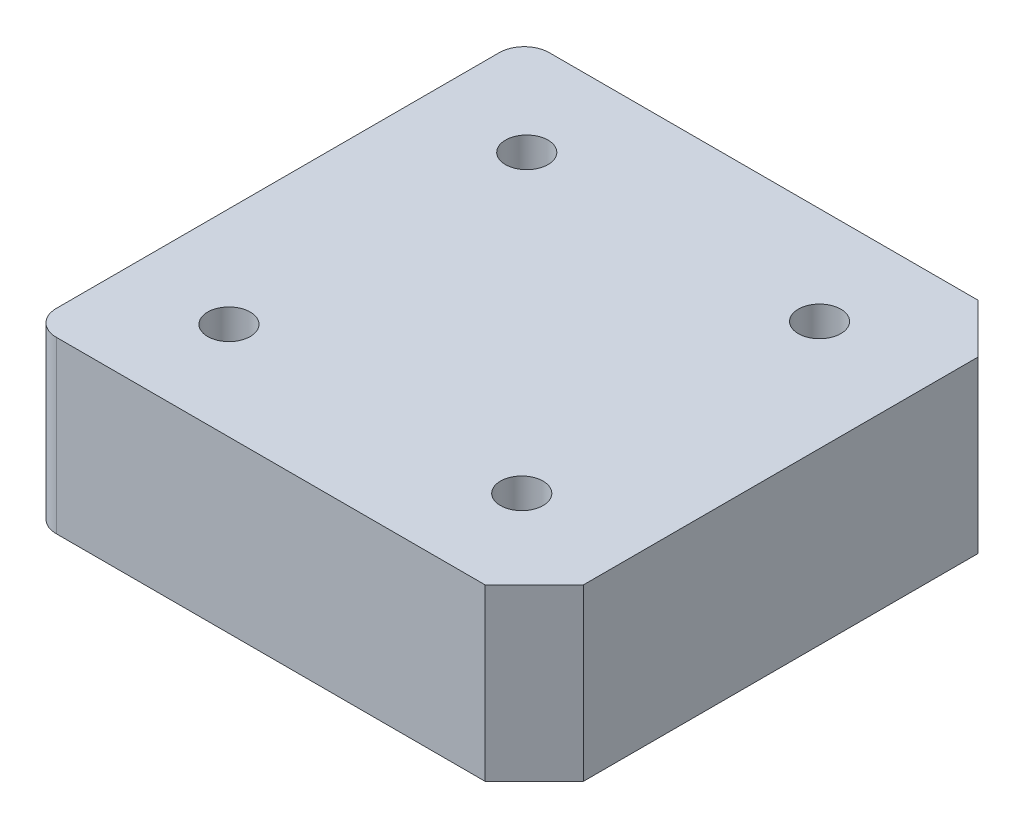
ISO-10303-21;
HEADER;
FILE_DESCRIPTION(('STEP AP214'),'2;1');
FILE_NAME('part.step','',(''),(''),'','','');
FILE_SCHEMA(('AUTOMOTIVE_DESIGN { 1 0 10303 214 1 1 1 1 }'));
ENDSEC;
DATA;
#1=APPLICATION_CONTEXT('core data for automotive mechanical design processes');
#2=APPLICATION_PROTOCOL_DEFINITION('international standard','automotive_design',2000,#1);
#3=PRODUCT_CONTEXT('',#1,'mechanical');
#4=PRODUCT('Part','Part','',(#3));
#5=PRODUCT_RELATED_PRODUCT_CATEGORY('part','',(#4));
#6=PRODUCT_DEFINITION_FORMATION('','',#4);
#7=PRODUCT_DEFINITION_CONTEXT('part definition',#1,'design');
#8=PRODUCT_DEFINITION('design','',#6,#7);
#9=PRODUCT_DEFINITION_SHAPE('','',#8);
#10=(LENGTH_UNIT() NAMED_UNIT(*) SI_UNIT(.MILLI.,.METRE.));
#11=(NAMED_UNIT(*) PLANE_ANGLE_UNIT() SI_UNIT($,.RADIAN.));
#12=(NAMED_UNIT(*) SI_UNIT($,.STERADIAN.) SOLID_ANGLE_UNIT());
#13=UNCERTAINTY_MEASURE_WITH_UNIT(LENGTH_MEASURE(1.E-05),#10,'distance_accuracy_value','');
#14=(GEOMETRIC_REPRESENTATION_CONTEXT(3) GLOBAL_UNCERTAINTY_ASSIGNED_CONTEXT((#13)) GLOBAL_UNIT_ASSIGNED_CONTEXT((#10,
#11,#12)) REPRESENTATION_CONTEXT('',''));
#15=CARTESIAN_POINT('',(0.,0.,0.));
#16=DIRECTION('',(0.,0.,1.));
#17=DIRECTION('',(1.,0.,0.));
#18=AXIS2_PLACEMENT_3D('',#15,#16,#17);
#19=CARTESIAN_POINT('',(-35.8327043665885,17.272,-23.3971438308483));
#20=DIRECTION('',(1.,0.,0.));
#21=DIRECTION('',(0.,0.,-1.));
#22=AXIS2_PLACEMENT_3D('',#19,#20,#21);
#23=PLANE('',#22);
#24=DIRECTION('',(0.,0.,1.));
#25=VECTOR('',#24,1.);
#26=CARTESIAN_POINT('',(-35.8327043665885,0.,-23.3971438308483));
#27=LINE('',#26,#25);
#28=CARTESIAN_POINT('',(-35.8327043665885,0.,-20.8571438308484));
#29=VERTEX_POINT('',#28);
#30=CARTESIAN_POINT('',(-35.8327043665885,0.,24.1008561691516));
#31=VERTEX_POINT('',#30);
#32=EDGE_CURVE('E166',#29,#31,#27,.T.);
#33=ORIENTED_EDGE('',*,*,#32,.T.);
#34=DIRECTION('',(0.,-1.,0.));
#35=VECTOR('',#34,1.);
#36=CARTESIAN_POINT('',(-35.8327043665885,17.272,24.1008561691516));
#37=LINE('',#36,#35);
#38=CARTESIAN_POINT('',(-35.8327043665885,17.272,24.1008561691516));
#39=VERTEX_POINT('',#38);
#40=EDGE_CURVE('E54',#31,#39,#37,.F.);
#41=ORIENTED_EDGE('',*,*,#40,.T.);
#42=DIRECTION('',(0.,0.,1.));
#43=VECTOR('',#42,1.);
#44=CARTESIAN_POINT('',(-35.8327043665885,17.272,-23.3971438308483));
#45=LINE('',#44,#43);
#46=CARTESIAN_POINT('',(-35.8327043665885,17.272,-20.8571438308484));
#47=VERTEX_POINT('',#46);
#48=EDGE_CURVE('E121',#47,#39,#45,.T.);
#49=ORIENTED_EDGE('',*,*,#48,.F.);
#50=DIRECTION('',(0.,-1.,0.));
#51=VECTOR('',#50,1.);
#52=CARTESIAN_POINT('',(-35.8327043665885,17.272,-20.8571438308484));
#53=LINE('',#52,#51);
#54=EDGE_CURVE('E148',#47,#29,#53,.T.);
#55=ORIENTED_EDGE('',*,*,#54,.T.);
#56=EDGE_LOOP('',(#33,#41,#49,#55));
#57=FACE_BOUND('',#56,.T.);
#58=ADVANCED_FACE('F33',(#57),#23,.F.);
#59=CARTESIAN_POINT('',(-35.8327043665885,17.272,26.6408561691517));
#60=DIRECTION('',(0.,0.,-1.));
#61=DIRECTION('',(-1.,0.,0.));
#62=AXIS2_PLACEMENT_3D('',#59,#60,#61);
#63=PLANE('',#62);
#64=DIRECTION('',(1.,0.,0.));
#65=VECTOR('',#64,1.);
#66=CARTESIAN_POINT('',(-35.8327043665885,17.272,26.6408561691517));
#67=LINE('',#66,#65);
#68=CARTESIAN_POINT('',(-33.2927043665885,17.272,26.6408561691517));
#69=VERTEX_POINT('',#68);
#70=CARTESIAN_POINT('',(10.2212956334114,17.272,26.6408561691517));
#71=VERTEX_POINT('',#70);
#72=EDGE_CURVE('E124',#69,#71,#67,.T.);
#73=ORIENTED_EDGE('',*,*,#72,.F.);
#74=DIRECTION('',(0.,-1.,0.));
#75=VECTOR('',#74,1.);
#76=CARTESIAN_POINT('',(-33.2927043665885,17.272,26.6408561691517));
#77=LINE('',#76,#75);
#78=CARTESIAN_POINT('',(-33.2927043665885,0.,26.6408561691517));
#79=VERTEX_POINT('',#78);
#80=EDGE_CURVE('E142',#69,#79,#77,.T.);
#81=ORIENTED_EDGE('',*,*,#80,.T.);
#82=DIRECTION('',(1.,0.,0.));
#83=VECTOR('',#82,1.);
#84=CARTESIAN_POINT('',(-35.8327043665885,0.,26.6408561691517));
#85=LINE('',#84,#83);
#86=CARTESIAN_POINT('',(10.2212956334114,0.,26.6408561691517));
#87=VERTEX_POINT('',#86);
#88=EDGE_CURVE('E126',#79,#87,#85,.T.);
#89=ORIENTED_EDGE('',*,*,#88,.T.);
#90=DIRECTION('',(0.,1.,0.));
#91=VECTOR('',#90,1.);
#92=CARTESIAN_POINT('',(10.2212956334114,17.272,26.6408561691517));
#93=LINE('',#92,#91);
#94=EDGE_CURVE('E139',#87,#71,#93,.T.);
#95=ORIENTED_EDGE('',*,*,#94,.T.);
#96=EDGE_LOOP('',(#73,#81,#89,#95));
#97=FACE_BOUND('',#96,.T.);
#98=ADVANCED_FACE('F160',(#97),#63,.F.);
#99=CARTESIAN_POINT('',(15.2212956334115,17.272,-23.3971438308483));
#100=DIRECTION('',(-1.,0.,0.));
#101=DIRECTION('',(0.,0.,1.));
#102=AXIS2_PLACEMENT_3D('',#99,#100,#101);
#103=PLANE('',#102);
#104=DIRECTION('',(0.,0.,-1.));
#105=VECTOR('',#104,1.);
#106=CARTESIAN_POINT('',(15.2212956334115,0.,-23.3971438308483));
#107=LINE('',#106,#105);
#108=CARTESIAN_POINT('',(15.2212956334115,0.,21.6408561691516));
#109=VERTEX_POINT('',#108);
#110=CARTESIAN_POINT('',(15.2212956334115,0.,-18.3971438308483));
#111=VERTEX_POINT('',#110);
#112=EDGE_CURVE('E122',#109,#111,#107,.T.);
#113=ORIENTED_EDGE('',*,*,#112,.T.);
#114=DIRECTION('',(0.,1.,0.));
#115=VECTOR('',#114,1.);
#116=CARTESIAN_POINT('',(15.2212956334115,17.272,-18.3971438308483));
#117=LINE('',#116,#115);
#118=CARTESIAN_POINT('',(15.2212956334115,17.272,-18.3971438308483));
#119=VERTEX_POINT('',#118);
#120=EDGE_CURVE('E105',#111,#119,#117,.T.);
#121=ORIENTED_EDGE('',*,*,#120,.T.);
#122=DIRECTION('',(0.,0.,-1.));
#123=VECTOR('',#122,1.);
#124=CARTESIAN_POINT('',(15.2212956334115,17.272,-23.3971438308483));
#125=LINE('',#124,#123);
#126=CARTESIAN_POINT('',(15.2212956334115,17.272,21.6408561691516));
#127=VERTEX_POINT('',#126);
#128=EDGE_CURVE('E163',#127,#119,#125,.T.);
#129=ORIENTED_EDGE('',*,*,#128,.F.);
#130=DIRECTION('',(0.,-1.,0.));
#131=VECTOR('',#130,1.);
#132=CARTESIAN_POINT('',(15.2212956334115,17.272,21.6408561691516));
#133=LINE('',#132,#131);
#134=EDGE_CURVE('E110',#127,#109,#133,.T.);
#135=ORIENTED_EDGE('',*,*,#134,.T.);
#136=EDGE_LOOP('',(#113,#121,#129,#135));
#137=FACE_BOUND('',#136,.T.);
#138=ADVANCED_FACE('F228',(#137),#103,.F.);
#139=CARTESIAN_POINT('',(-35.8327043665885,17.272,-23.3971438308483));
#140=DIRECTION('',(0.,0.,1.));
#141=DIRECTION('',(1.,0.,0.));
#142=AXIS2_PLACEMENT_3D('',#139,#140,#141);
#143=PLANE('',#142);
#144=DIRECTION('',(-1.,0.,0.));
#145=VECTOR('',#144,1.);
#146=CARTESIAN_POINT('',(-35.8327043665885,0.,-23.3971438308483));
#147=LINE('',#146,#145);
#148=CARTESIAN_POINT('',(10.2212956334114,0.,-23.3971438308483));
#149=VERTEX_POINT('',#148);
#150=CARTESIAN_POINT('',(-33.2927043665885,0.,-23.3971438308483));
#151=VERTEX_POINT('',#150);
#152=EDGE_CURVE('E114',#149,#151,#147,.T.);
#153=ORIENTED_EDGE('',*,*,#152,.T.);
#154=DIRECTION('',(0.,-1.,0.));
#155=VECTOR('',#154,1.);
#156=CARTESIAN_POINT('',(-33.2927043665885,17.272,-23.3971438308483));
#157=LINE('',#156,#155);
#158=CARTESIAN_POINT('',(-33.2927043665885,17.272,-23.3971438308483));
#159=VERTEX_POINT('',#158);
#160=EDGE_CURVE('E11',#151,#159,#157,.F.);
#161=ORIENTED_EDGE('',*,*,#160,.T.);
#162=DIRECTION('',(-1.,0.,0.));
#163=VECTOR('',#162,1.);
#164=CARTESIAN_POINT('',(-35.8327043665885,17.272,-23.3971438308483));
#165=LINE('',#164,#163);
#166=CARTESIAN_POINT('',(10.2212956334114,17.272,-23.3971438308483));
#167=VERTEX_POINT('',#166);
#168=EDGE_CURVE('E115',#167,#159,#165,.T.);
#169=ORIENTED_EDGE('',*,*,#168,.F.);
#170=DIRECTION('',(0.,-1.,0.));
#171=VECTOR('',#170,1.);
#172=CARTESIAN_POINT('',(10.2212956334115,17.272,-23.3971438308483));
#173=LINE('',#172,#171);
#174=EDGE_CURVE('E104',#167,#149,#173,.T.);
#175=ORIENTED_EDGE('',*,*,#174,.T.);
#176=EDGE_LOOP('',(#153,#161,#169,#175));
#177=FACE_BOUND('',#176,.T.);
#178=ADVANCED_FACE('F113',(#177),#143,.F.);
#179=CARTESIAN_POINT('',(0.,17.272,0.));
#180=DIRECTION('',(0.,1.,0.));
#181=DIRECTION('',(0.,0.,1.));
#182=AXIS2_PLACEMENT_3D('',#179,#180,#181);
#183=PLANE('',#182);
#184=CARTESIAN_POINT('',(-25.6727043665885,17.272,16.7348561691517));
#185=DIRECTION('',(0.,1.,0.));
#186=DIRECTION('',(0.,0.,1.));
#187=AXIS2_PLACEMENT_3D('',#184,#185,#186);
#188=CIRCLE('',#187,2.159);
#189=CARTESIAN_POINT('',(-25.6727043665885,17.272,18.8938561691517));
#190=VERTEX_POINT('',#189);
#191=EDGE_CURVE('E180',#190,#190,#188,.T.);
#192=ORIENTED_EDGE('',*,*,#191,.F.);
#193=EDGE_LOOP('',(#192));
#194=FACE_BOUND('',#193,.T.);
#195=CARTESIAN_POINT('',(4.04529563341147,17.272,16.7348561691517));
#196=DIRECTION('',(0.,1.,0.));
#197=DIRECTION('',(0.,0.,1.));
#198=AXIS2_PLACEMENT_3D('',#195,#196,#197);
#199=CIRCLE('',#198,2.159);
#200=CARTESIAN_POINT('',(4.04529563341147,17.272,18.8938561691516));
#201=VERTEX_POINT('',#200);
#202=EDGE_CURVE('E186',#201,#201,#199,.T.);
#203=ORIENTED_EDGE('',*,*,#202,.F.);
#204=EDGE_LOOP('',(#203));
#205=FACE_BOUND('',#204,.T.);
#206=CARTESIAN_POINT('',(4.04529563341146,17.272,-13.4911438308483));
#207=DIRECTION('',(0.,1.,0.));
#208=DIRECTION('',(0.,0.,1.));
#209=AXIS2_PLACEMENT_3D('',#206,#207,#208);
#210=CIRCLE('',#209,2.159);
#211=CARTESIAN_POINT('',(4.04529563341146,17.272,-11.3321438308483));
#212=VERTEX_POINT('',#211);
#213=EDGE_CURVE('E192',#212,#212,#210,.T.);
#214=ORIENTED_EDGE('',*,*,#213,.F.);
#215=EDGE_LOOP('',(#214));
#216=FACE_BOUND('',#215,.T.);
#217=CARTESIAN_POINT('',(-25.6727043665885,17.272,-13.4911438308483));
#218=DIRECTION('',(0.,1.,0.));
#219=DIRECTION('',(0.,0.,1.));
#220=AXIS2_PLACEMENT_3D('',#217,#218,#219);
#221=CIRCLE('',#220,2.159);
#222=CARTESIAN_POINT('',(-25.6727043665885,17.272,-11.3321438308483));
#223=VERTEX_POINT('',#222);
#224=EDGE_CURVE('E171',#223,#223,#221,.T.);
#225=ORIENTED_EDGE('',*,*,#224,.F.);
#226=EDGE_LOOP('',(#225));
#227=FACE_BOUND('',#226,.T.);
#228=ORIENTED_EDGE('',*,*,#48,.T.);
#229=CARTESIAN_POINT('',(-33.2927043665885,17.272,24.1008561691517));
#230=DIRECTION('',(0.,1.,0.));
#231=DIRECTION('',(0.,0.,1.));
#232=AXIS2_PLACEMENT_3D('',#229,#230,#231);
#233=CIRCLE('',#232,2.54);
#234=EDGE_CURVE('E41',#39,#69,#233,.T.);
#235=ORIENTED_EDGE('',*,*,#234,.T.);
#236=ORIENTED_EDGE('',*,*,#72,.T.);
#237=DIRECTION('',(-0.707106781186549,0.,0.707106781186547));
#238=VECTOR('',#237,1.);
#239=CARTESIAN_POINT('',(18.4310759012815,17.272,18.4310759012816));
#240=LINE('',#239,#238);
#241=EDGE_CURVE('E135',#71,#127,#240,.F.);
#242=ORIENTED_EDGE('',*,*,#241,.T.);
#243=ORIENTED_EDGE('',*,*,#128,.T.);
#244=DIRECTION('',(0.707106781186547,0.,0.707106781186549));
#245=VECTOR('',#244,1.);
#246=CARTESIAN_POINT('',(16.8092197321299,17.272,-16.8092197321299));
#247=LINE('',#246,#245);
#248=EDGE_CURVE('E137',#119,#167,#247,.F.);
#249=ORIENTED_EDGE('',*,*,#248,.T.);
#250=ORIENTED_EDGE('',*,*,#168,.T.);
#251=CARTESIAN_POINT('',(-33.2927043665885,17.272,-20.8571438308484));
#252=DIRECTION('',(0.,1.,0.));
#253=DIRECTION('',(0.,0.,1.));
#254=AXIS2_PLACEMENT_3D('',#251,#252,#253);
#255=CIRCLE('',#254,2.54);
#256=EDGE_CURVE('E152',#159,#47,#255,.T.);
#257=ORIENTED_EDGE('',*,*,#256,.T.);
#258=EDGE_LOOP('',(#228,#235,#236,#242,#243,#249,#250,#257));
#259=FACE_BOUND('',#258,.T.);
#260=ADVANCED_FACE('F156',(#194,#205,#216,#227,#259),#183,.T.);
#261=CARTESIAN_POINT('',(0.,0.,0.));
#262=DIRECTION('',(0.,1.,0.));
#263=DIRECTION('',(0.,0.,1.));
#264=AXIS2_PLACEMENT_3D('',#261,#262,#263);
#265=PLANE('',#264);
#266=CARTESIAN_POINT('',(-25.6727043665885,0.,16.7348561691517));
#267=DIRECTION('',(0.,1.,0.));
#268=DIRECTION('',(0.,0.,1.));
#269=AXIS2_PLACEMENT_3D('',#266,#267,#268);
#270=CIRCLE('',#269,2.159);
#271=CARTESIAN_POINT('',(-25.6727043665885,0.,18.8938561691517));
#272=VERTEX_POINT('',#271);
#273=EDGE_CURVE('E183',#272,#272,#270,.T.);
#274=ORIENTED_EDGE('',*,*,#273,.T.);
#275=EDGE_LOOP('',(#274));
#276=FACE_BOUND('',#275,.T.);
#277=CARTESIAN_POINT('',(4.04529563341147,0.,16.7348561691517));
#278=DIRECTION('',(0.,1.,0.));
#279=DIRECTION('',(0.,0.,1.));
#280=AXIS2_PLACEMENT_3D('',#277,#278,#279);
#281=CIRCLE('',#280,2.159);
#282=CARTESIAN_POINT('',(4.04529563341147,0.,18.8938561691516));
#283=VERTEX_POINT('',#282);
#284=EDGE_CURVE('E189',#283,#283,#281,.T.);
#285=ORIENTED_EDGE('',*,*,#284,.T.);
#286=EDGE_LOOP('',(#285));
#287=FACE_BOUND('',#286,.T.);
#288=CARTESIAN_POINT('',(4.04529563341146,0.,-13.4911438308483));
#289=DIRECTION('',(0.,1.,0.));
#290=DIRECTION('',(0.,0.,1.));
#291=AXIS2_PLACEMENT_3D('',#288,#289,#290);
#292=CIRCLE('',#291,2.159);
#293=CARTESIAN_POINT('',(4.04529563341146,0.,-11.3321438308483));
#294=VERTEX_POINT('',#293);
#295=EDGE_CURVE('E178',#294,#294,#292,.T.);
#296=ORIENTED_EDGE('',*,*,#295,.T.);
#297=EDGE_LOOP('',(#296));
#298=FACE_BOUND('',#297,.T.);
#299=CARTESIAN_POINT('',(-25.6727043665885,0.,-13.4911438308483));
#300=DIRECTION('',(0.,1.,0.));
#301=DIRECTION('',(0.,0.,1.));
#302=AXIS2_PLACEMENT_3D('',#299,#300,#301);
#303=CIRCLE('',#302,2.159);
#304=CARTESIAN_POINT('',(-25.6727043665885,0.,-11.3321438308483));
#305=VERTEX_POINT('',#304);
#306=EDGE_CURVE('E168',#305,#305,#303,.T.);
#307=ORIENTED_EDGE('',*,*,#306,.T.);
#308=EDGE_LOOP('',(#307));
#309=FACE_BOUND('',#308,.T.);
#310=ORIENTED_EDGE('',*,*,#88,.F.);
#311=CARTESIAN_POINT('',(-33.2927043665885,0.,24.1008561691517));
#312=DIRECTION('',(0.,1.,0.));
#313=DIRECTION('',(0.,0.,1.));
#314=AXIS2_PLACEMENT_3D('',#311,#312,#313);
#315=CIRCLE('',#314,2.54);
#316=EDGE_CURVE('E146',#79,#31,#315,.F.);
#317=ORIENTED_EDGE('',*,*,#316,.T.);
#318=ORIENTED_EDGE('',*,*,#32,.F.);
#319=CARTESIAN_POINT('',(-33.2927043665885,0.,-20.8571438308484));
#320=DIRECTION('',(0.,1.,0.));
#321=DIRECTION('',(0.,0.,1.));
#322=AXIS2_PLACEMENT_3D('',#319,#320,#321);
#323=CIRCLE('',#322,2.54);
#324=EDGE_CURVE('E120',#29,#151,#323,.F.);
#325=ORIENTED_EDGE('',*,*,#324,.T.);
#326=ORIENTED_EDGE('',*,*,#152,.F.);
#327=DIRECTION('',(-0.707106781186547,0.,-0.707106781186549));
#328=VECTOR('',#327,1.);
#329=CARTESIAN_POINT('',(10.2212956334115,0.,-23.3971438308483));
#330=LINE('',#329,#328);
#331=EDGE_CURVE('E100',#149,#111,#330,.F.);
#332=ORIENTED_EDGE('',*,*,#331,.T.);
#333=ORIENTED_EDGE('',*,*,#112,.F.);
#334=DIRECTION('',(0.707106781186549,0.,-0.707106781186547));
#335=VECTOR('',#334,1.);
#336=CARTESIAN_POINT('',(15.2212956334115,0.,21.6408561691516));
#337=LINE('',#336,#335);
#338=EDGE_CURVE('E111',#109,#87,#337,.F.);
#339=ORIENTED_EDGE('',*,*,#338,.T.);
#340=EDGE_LOOP('',(#310,#317,#318,#325,#326,#332,#333,#339));
#341=FACE_BOUND('',#340,.T.);
#342=ADVANCED_FACE('F118',(#276,#287,#298,#309,#341),#265,.F.);
#343=CARTESIAN_POINT('',(10.2212956334115,17.272,-23.3971438308483));
#344=DIRECTION('',(-0.707106781186549,0.,0.707106781186547));
#345=DIRECTION('',(0.,-1.,0.));
#346=AXIS2_PLACEMENT_3D('',#343,#344,#345);
#347=PLANE('',#346);
#348=ORIENTED_EDGE('',*,*,#248,.F.);
#349=ORIENTED_EDGE('',*,*,#120,.F.);
#350=ORIENTED_EDGE('',*,*,#331,.F.);
#351=ORIENTED_EDGE('',*,*,#174,.F.);
#352=EDGE_LOOP('',(#348,#349,#350,#351));
#353=FACE_BOUND('',#352,.T.);
#354=ADVANCED_FACE('F103',(#353),#347,.F.);
#355=CARTESIAN_POINT('',(15.2212956334115,17.272,21.6408561691516));
#356=DIRECTION('',(-0.707106781186547,0.,-0.707106781186549));
#357=DIRECTION('',(0.,-1.,0.));
#358=AXIS2_PLACEMENT_3D('',#355,#356,#357);
#359=PLANE('',#358);
#360=ORIENTED_EDGE('',*,*,#241,.F.);
#361=ORIENTED_EDGE('',*,*,#94,.F.);
#362=ORIENTED_EDGE('',*,*,#338,.F.);
#363=ORIENTED_EDGE('',*,*,#134,.F.);
#364=EDGE_LOOP('',(#360,#361,#362,#363));
#365=FACE_BOUND('',#364,.T.);
#366=ADVANCED_FACE('F234',(#365),#359,.F.);
#367=CARTESIAN_POINT('',(-33.2927043665885,17.272,24.1008561691517));
#368=DIRECTION('',(0.,-1.,0.));
#369=DIRECTION('',(0.,0.,-1.));
#370=AXIS2_PLACEMENT_3D('',#367,#368,#369);
#371=CYLINDRICAL_SURFACE('',#370,2.54);
#372=ORIENTED_EDGE('',*,*,#234,.F.);
#373=ORIENTED_EDGE('',*,*,#40,.F.);
#374=ORIENTED_EDGE('',*,*,#316,.F.);
#375=ORIENTED_EDGE('',*,*,#80,.F.);
#376=EDGE_LOOP('',(#372,#373,#374,#375));
#377=FACE_BOUND('',#376,.T.);
#378=ADVANCED_FACE('F165',(#377),#371,.T.);
#379=CARTESIAN_POINT('',(-33.2927043665885,17.272,-20.8571438308484));
#380=DIRECTION('',(0.,-1.,0.));
#381=DIRECTION('',(0.,0.,-1.));
#382=AXIS2_PLACEMENT_3D('',#379,#380,#381);
#383=CYLINDRICAL_SURFACE('',#382,2.54);
#384=ORIENTED_EDGE('',*,*,#256,.F.);
#385=ORIENTED_EDGE('',*,*,#160,.F.);
#386=ORIENTED_EDGE('',*,*,#324,.F.);
#387=ORIENTED_EDGE('',*,*,#54,.F.);
#388=EDGE_LOOP('',(#384,#385,#386,#387));
#389=FACE_BOUND('',#388,.T.);
#390=ADVANCED_FACE('F35',(#389),#383,.T.);
#391=CARTESIAN_POINT('',(-25.6727043665885,0.,-13.4911438308483));
#392=DIRECTION('',(0.,1.,0.));
#393=DIRECTION('',(0.,0.,1.));
#394=AXIS2_PLACEMENT_3D('',#391,#392,#393);
#395=CYLINDRICAL_SURFACE('',#394,2.159);
#396=ORIENTED_EDGE('',*,*,#306,.F.);
#397=EDGE_LOOP('',(#396));
#398=FACE_BOUND('',#397,.T.);
#399=ORIENTED_EDGE('',*,*,#224,.T.);
#400=EDGE_LOOP('',(#399));
#401=FACE_BOUND('',#400,.T.);
#402=ADVANCED_FACE('F204',(#398,#401),#395,.F.);
#403=CARTESIAN_POINT('',(4.04529563341146,0.,-13.4911438308483));
#404=DIRECTION('',(0.,1.,0.));
#405=DIRECTION('',(0.,0.,1.));
#406=AXIS2_PLACEMENT_3D('',#403,#404,#405);
#407=CYLINDRICAL_SURFACE('',#406,2.159);
#408=ORIENTED_EDGE('',*,*,#295,.F.);
#409=EDGE_LOOP('',(#408));
#410=FACE_BOUND('',#409,.T.);
#411=ORIENTED_EDGE('',*,*,#213,.T.);
#412=EDGE_LOOP('',(#411));
#413=FACE_BOUND('',#412,.T.);
#414=ADVANCED_FACE('F200',(#410,#413),#407,.F.);
#415=CARTESIAN_POINT('',(4.04529563341147,0.,16.7348561691517));
#416=DIRECTION('',(0.,1.,0.));
#417=DIRECTION('',(0.,0.,1.));
#418=AXIS2_PLACEMENT_3D('',#415,#416,#417);
#419=CYLINDRICAL_SURFACE('',#418,2.159);
#420=ORIENTED_EDGE('',*,*,#284,.F.);
#421=EDGE_LOOP('',(#420));
#422=FACE_BOUND('',#421,.T.);
#423=ORIENTED_EDGE('',*,*,#202,.T.);
#424=EDGE_LOOP('',(#423));
#425=FACE_BOUND('',#424,.T.);
#426=ADVANCED_FACE('F203',(#422,#425),#419,.F.);
#427=CARTESIAN_POINT('',(-25.6727043665885,0.,16.7348561691517));
#428=DIRECTION('',(0.,1.,0.));
#429=DIRECTION('',(0.,0.,1.));
#430=AXIS2_PLACEMENT_3D('',#427,#428,#429);
#431=CYLINDRICAL_SURFACE('',#430,2.159);
#432=ORIENTED_EDGE('',*,*,#273,.F.);
#433=EDGE_LOOP('',(#432));
#434=FACE_BOUND('',#433,.T.);
#435=ORIENTED_EDGE('',*,*,#191,.T.);
#436=EDGE_LOOP('',(#435));
#437=FACE_BOUND('',#436,.T.);
#438=ADVANCED_FACE('F278',(#434,#437),#431,.F.);
#439=CLOSED_SHELL('',(#58,#98,#138,#178,#260,#342,#354,#366,#378,#390,#402,#414,#426,#438));
#440=MANIFOLD_SOLID_BREP('B2',#439);
#441=ADVANCED_BREP_SHAPE_REPRESENTATION('',(#18,#440),#14);
#442=SHAPE_DEFINITION_REPRESENTATION(#9,#441);
ENDSEC;
END-ISO-10303-21;
